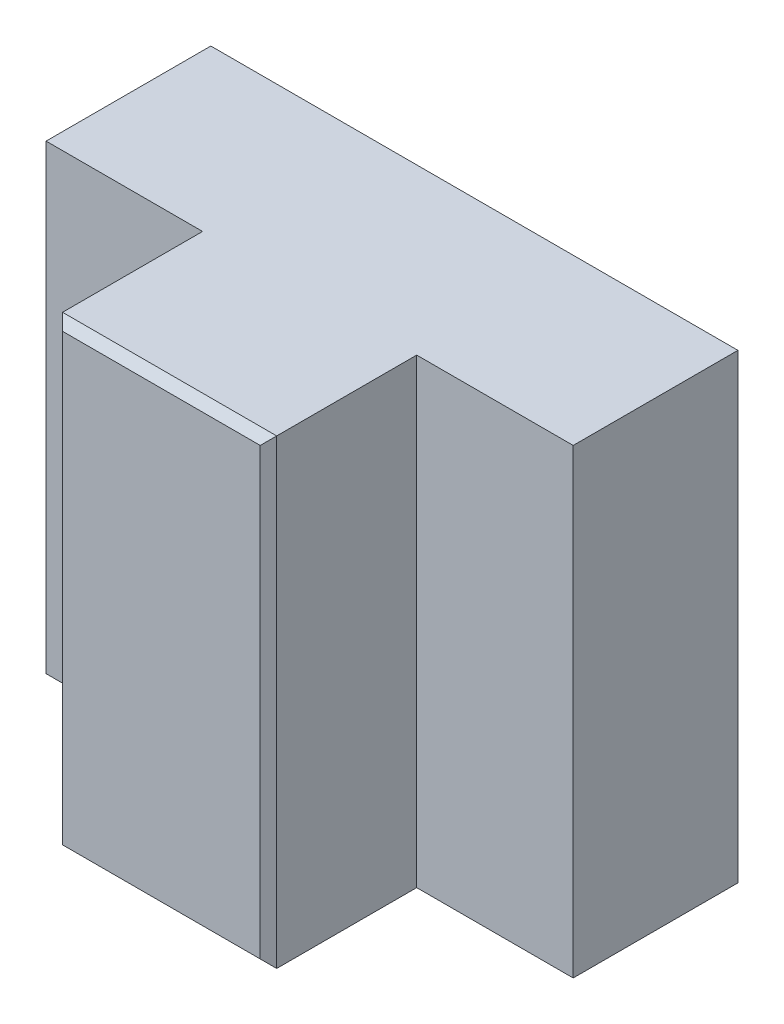
ISO-10303-21;
HEADER;
FILE_DESCRIPTION(('STEP AP214'),'2;1');
FILE_NAME('part.step','',(''),(''),'','','');
FILE_SCHEMA(('AUTOMOTIVE_DESIGN { 1 0 10303 214 1 1 1 1 }'));
ENDSEC;
DATA;
#1=APPLICATION_CONTEXT('core data for automotive mechanical design processes');
#2=APPLICATION_PROTOCOL_DEFINITION('international standard','automotive_design',2000,#1);
#3=PRODUCT_CONTEXT('',#1,'mechanical');
#4=PRODUCT('Part','Part','',(#3));
#5=PRODUCT_RELATED_PRODUCT_CATEGORY('part','',(#4));
#6=PRODUCT_DEFINITION_FORMATION('','',#4);
#7=PRODUCT_DEFINITION_CONTEXT('part definition',#1,'design');
#8=PRODUCT_DEFINITION('design','',#6,#7);
#9=PRODUCT_DEFINITION_SHAPE('','',#8);
#10=(LENGTH_UNIT() NAMED_UNIT(*) SI_UNIT(.MILLI.,.METRE.));
#11=(NAMED_UNIT(*) PLANE_ANGLE_UNIT() SI_UNIT($,.RADIAN.));
#12=(NAMED_UNIT(*) SI_UNIT($,.STERADIAN.) SOLID_ANGLE_UNIT());
#13=UNCERTAINTY_MEASURE_WITH_UNIT(LENGTH_MEASURE(1.E-05),#10,'distance_accuracy_value','');
#14=(GEOMETRIC_REPRESENTATION_CONTEXT(3) GLOBAL_UNCERTAINTY_ASSIGNED_CONTEXT((#13)) GLOBAL_UNIT_ASSIGNED_CONTEXT((#10,
#11,#12)) REPRESENTATION_CONTEXT('',''));
#15=CARTESIAN_POINT('',(0.,0.,0.));
#16=DIRECTION('',(0.,0.,1.));
#17=DIRECTION('',(1.,0.,0.));
#18=AXIS2_PLACEMENT_3D('',#15,#16,#17);
#19=CARTESIAN_POINT('',(0.,0.,10.));
#20=DIRECTION('',(0.,0.,1.));
#21=DIRECTION('',(1.,0.,0.));
#22=AXIS2_PLACEMENT_3D('',#19,#20,#21);
#23=PLANE('',#22);
#24=DIRECTION('',(0.,-1.,0.));
#25=VECTOR('',#24,1.);
#26=CARTESIAN_POINT('',(-6.5,-14.,10.));
#27=LINE('',#26,#25);
#28=CARTESIAN_POINT('',(-6.5,14.,10.));
#29=VERTEX_POINT('',#28);
#30=CARTESIAN_POINT('',(-6.5,-14.,10.));
#31=VERTEX_POINT('',#30);
#32=EDGE_CURVE('E148',#29,#31,#27,.T.);
#33=ORIENTED_EDGE('',*,*,#32,.F.);
#34=DIRECTION('',(-1.,0.,0.));
#35=VECTOR('',#34,1.);
#36=CARTESIAN_POINT('',(-16.,14.,10.));
#37=LINE('',#36,#35);
#38=CARTESIAN_POINT('',(-16.,14.,10.));
#39=VERTEX_POINT('',#38);
#40=EDGE_CURVE('E144',#29,#39,#37,.T.);
#41=ORIENTED_EDGE('',*,*,#40,.T.);
#42=DIRECTION('',(0.,-1.,0.));
#43=VECTOR('',#42,1.);
#44=CARTESIAN_POINT('',(-16.,14.,10.));
#45=LINE('',#44,#43);
#46=CARTESIAN_POINT('',(-16.,-14.,10.));
#47=VERTEX_POINT('',#46);
#48=EDGE_CURVE('E143',#39,#47,#45,.T.);
#49=ORIENTED_EDGE('',*,*,#48,.T.);
#50=DIRECTION('',(1.,0.,0.));
#51=VECTOR('',#50,1.);
#52=CARTESIAN_POINT('',(-16.,-14.,10.));
#53=LINE('',#52,#51);
#54=EDGE_CURVE('E169',#47,#31,#53,.T.);
#55=ORIENTED_EDGE('',*,*,#54,.T.);
#56=EDGE_LOOP('',(#33,#41,#49,#55));
#57=FACE_BOUND('',#56,.T.);
#58=ADVANCED_FACE('F41',(#57),#23,.T.);
#59=CARTESIAN_POINT('',(16.,14.,10.));
#60=DIRECTION('',(-1.,0.,0.));
#61=DIRECTION('',(0.,0.,1.));
#62=AXIS2_PLACEMENT_3D('',#59,#60,#61);
#63=PLANE('',#62);
#64=DIRECTION('',(0.,1.,0.));
#65=VECTOR('',#64,1.);
#66=CARTESIAN_POINT('',(16.,14.,0.));
#67=LINE('',#66,#65);
#68=CARTESIAN_POINT('',(16.,-14.,0.));
#69=VERTEX_POINT('',#68);
#70=CARTESIAN_POINT('',(16.,14.,0.));
#71=VERTEX_POINT('',#70);
#72=EDGE_CURVE('E162',#69,#71,#67,.T.);
#73=ORIENTED_EDGE('',*,*,#72,.T.);
#74=DIRECTION('',(0.,0.,-1.));
#75=VECTOR('',#74,1.);
#76=CARTESIAN_POINT('',(16.,14.,10.));
#77=LINE('',#76,#75);
#78=CARTESIAN_POINT('',(16.,14.,10.));
#79=VERTEX_POINT('',#78);
#80=EDGE_CURVE('E196',#79,#71,#77,.T.);
#81=ORIENTED_EDGE('',*,*,#80,.F.);
#82=DIRECTION('',(0.,1.,0.));
#83=VECTOR('',#82,1.);
#84=CARTESIAN_POINT('',(16.,14.,10.));
#85=LINE('',#84,#83);
#86=CARTESIAN_POINT('',(16.,-14.,10.));
#87=VERTEX_POINT('',#86);
#88=EDGE_CURVE('E140',#87,#79,#85,.T.);
#89=ORIENTED_EDGE('',*,*,#88,.F.);
#90=DIRECTION('',(0.,0.,-1.));
#91=VECTOR('',#90,1.);
#92=CARTESIAN_POINT('',(16.,-14.,10.));
#93=LINE('',#92,#91);
#94=EDGE_CURVE('E173',#87,#69,#93,.T.);
#95=ORIENTED_EDGE('',*,*,#94,.T.);
#96=EDGE_LOOP('',(#73,#81,#89,#95));
#97=FACE_BOUND('',#96,.T.);
#98=ADVANCED_FACE('F273',(#97),#63,.F.);
#99=CARTESIAN_POINT('',(-16.,14.,10.));
#100=DIRECTION('',(0.,-1.,0.));
#101=DIRECTION('',(0.,0.,-1.));
#102=AXIS2_PLACEMENT_3D('',#99,#100,#101);
#103=PLANE('',#102);
#104=DIRECTION('',(0.,0.,-1.));
#105=VECTOR('',#104,1.);
#106=CARTESIAN_POINT('',(-6.5,14.,19.));
#107=LINE('',#106,#105);
#108=CARTESIAN_POINT('',(-6.5,14.,18.5));
#109=VERTEX_POINT('',#108);
#110=EDGE_CURVE('E159',#109,#29,#107,.T.);
#111=ORIENTED_EDGE('',*,*,#110,.F.);
#112=DIRECTION('',(1.,0.,0.));
#113=VECTOR('',#112,1.);
#114=CARTESIAN_POINT('',(-16.,14.,18.5));
#115=LINE('',#114,#113);
#116=CARTESIAN_POINT('',(6.5,14.,18.5));
#117=VERTEX_POINT('',#116);
#118=EDGE_CURVE('E11',#109,#117,#115,.T.);
#119=ORIENTED_EDGE('',*,*,#118,.T.);
#120=DIRECTION('',(0.,0.,-1.));
#121=VECTOR('',#120,1.);
#122=CARTESIAN_POINT('',(6.5,14.,19.));
#123=LINE('',#122,#121);
#124=CARTESIAN_POINT('',(6.5,14.,10.));
#125=VERTEX_POINT('',#124);
#126=EDGE_CURVE('E120',#117,#125,#123,.T.);
#127=ORIENTED_EDGE('',*,*,#126,.T.);
#128=EDGE_CURVE('E124',#79,#125,#37,.T.);
#129=ORIENTED_EDGE('',*,*,#128,.F.);
#130=ORIENTED_EDGE('',*,*,#80,.T.);
#131=DIRECTION('',(-1.,0.,0.));
#132=VECTOR('',#131,1.);
#133=CARTESIAN_POINT('',(-16.,14.,0.));
#134=LINE('',#133,#132);
#135=CARTESIAN_POINT('',(-16.,14.,0.));
#136=VERTEX_POINT('',#135);
#137=EDGE_CURVE('E177',#71,#136,#134,.T.);
#138=ORIENTED_EDGE('',*,*,#137,.T.);
#139=DIRECTION('',(0.,0.,-1.));
#140=VECTOR('',#139,1.);
#141=CARTESIAN_POINT('',(-16.,14.,10.));
#142=LINE('',#141,#140);
#143=EDGE_CURVE('E192',#39,#136,#142,.T.);
#144=ORIENTED_EDGE('',*,*,#143,.F.);
#145=ORIENTED_EDGE('',*,*,#40,.F.);
#146=EDGE_LOOP('',(#111,#119,#127,#129,#130,#138,#144,#145));
#147=FACE_BOUND('',#146,.T.);
#148=ADVANCED_FACE('F122',(#147),#103,.F.);
#149=CARTESIAN_POINT('',(-16.,14.,10.));
#150=DIRECTION('',(1.,0.,0.));
#151=DIRECTION('',(0.,0.,-1.));
#152=AXIS2_PLACEMENT_3D('',#149,#150,#151);
#153=PLANE('',#152);
#154=DIRECTION('',(0.,-1.,0.));
#155=VECTOR('',#154,1.);
#156=CARTESIAN_POINT('',(-16.,14.,0.));
#157=LINE('',#156,#155);
#158=CARTESIAN_POINT('',(-16.,-14.,0.));
#159=VERTEX_POINT('',#158);
#160=EDGE_CURVE('E180',#136,#159,#157,.T.);
#161=ORIENTED_EDGE('',*,*,#160,.T.);
#162=DIRECTION('',(0.,0.,-1.));
#163=VECTOR('',#162,1.);
#164=CARTESIAN_POINT('',(-16.,-14.,10.));
#165=LINE('',#164,#163);
#166=EDGE_CURVE('E188',#47,#159,#165,.T.);
#167=ORIENTED_EDGE('',*,*,#166,.F.);
#168=ORIENTED_EDGE('',*,*,#48,.F.);
#169=ORIENTED_EDGE('',*,*,#143,.T.);
#170=EDGE_LOOP('',(#161,#167,#168,#169));
#171=FACE_BOUND('',#170,.T.);
#172=ADVANCED_FACE('F256',(#171),#153,.F.);
#173=CARTESIAN_POINT('',(-16.,-14.,10.));
#174=DIRECTION('',(0.,1.,0.));
#175=DIRECTION('',(0.,0.,1.));
#176=AXIS2_PLACEMENT_3D('',#173,#174,#175);
#177=PLANE('',#176);
#178=DIRECTION('',(0.,0.,-1.));
#179=VECTOR('',#178,1.);
#180=CARTESIAN_POINT('',(6.5,-14.,19.));
#181=LINE('',#180,#179);
#182=CARTESIAN_POINT('',(6.5,-14.,18.5));
#183=VERTEX_POINT('',#182);
#184=CARTESIAN_POINT('',(6.5,-14.,10.));
#185=VERTEX_POINT('',#184);
#186=EDGE_CURVE('E132',#183,#185,#181,.T.);
#187=ORIENTED_EDGE('',*,*,#186,.F.);
#188=DIRECTION('',(-1.,0.,0.));
#189=VECTOR('',#188,1.);
#190=CARTESIAN_POINT('',(-16.,-14.,18.5));
#191=LINE('',#190,#189);
#192=CARTESIAN_POINT('',(-6.5,-14.,18.5));
#193=VERTEX_POINT('',#192);
#194=EDGE_CURVE('E67',#183,#193,#191,.T.);
#195=ORIENTED_EDGE('',*,*,#194,.T.);
#196=DIRECTION('',(0.,0.,-1.));
#197=VECTOR('',#196,1.);
#198=CARTESIAN_POINT('',(-6.5,-14.,19.));
#199=LINE('',#198,#197);
#200=EDGE_CURVE('E156',#193,#31,#199,.T.);
#201=ORIENTED_EDGE('',*,*,#200,.T.);
#202=ORIENTED_EDGE('',*,*,#54,.F.);
#203=ORIENTED_EDGE('',*,*,#166,.T.);
#204=DIRECTION('',(1.,0.,0.));
#205=VECTOR('',#204,1.);
#206=CARTESIAN_POINT('',(-16.,-14.,0.));
#207=LINE('',#206,#205);
#208=EDGE_CURVE('E164',#159,#69,#207,.T.);
#209=ORIENTED_EDGE('',*,*,#208,.T.);
#210=ORIENTED_EDGE('',*,*,#94,.F.);
#211=EDGE_CURVE('E168',#185,#87,#53,.T.);
#212=ORIENTED_EDGE('',*,*,#211,.F.);
#213=EDGE_LOOP('',(#187,#195,#201,#202,#203,#209,#210,#212));
#214=FACE_BOUND('',#213,.T.);
#215=ADVANCED_FACE('F244',(#214),#177,.F.);
#216=DIRECTION('',(0.,1.,0.));
#217=VECTOR('',#216,1.);
#218=CARTESIAN_POINT('',(6.5,14.,10.));
#219=LINE('',#218,#217);
#220=EDGE_CURVE('E133',#185,#125,#219,.T.);
#221=ORIENTED_EDGE('',*,*,#220,.F.);
#222=ORIENTED_EDGE('',*,*,#211,.T.);
#223=ORIENTED_EDGE('',*,*,#88,.T.);
#224=ORIENTED_EDGE('',*,*,#128,.T.);
#225=EDGE_LOOP('',(#221,#222,#223,#224));
#226=FACE_BOUND('',#225,.T.);
#227=ADVANCED_FACE('F137',(#226),#23,.T.);
#228=CARTESIAN_POINT('',(0.,0.,0.));
#229=DIRECTION('',(0.,0.,1.));
#230=DIRECTION('',(1.,0.,0.));
#231=AXIS2_PLACEMENT_3D('',#228,#229,#230);
#232=PLANE('',#231);
#233=ORIENTED_EDGE('',*,*,#72,.F.);
#234=ORIENTED_EDGE('',*,*,#208,.F.);
#235=ORIENTED_EDGE('',*,*,#160,.F.);
#236=ORIENTED_EDGE('',*,*,#137,.F.);
#237=EDGE_LOOP('',(#233,#234,#235,#236));
#238=FACE_BOUND('',#237,.T.);
#239=ADVANCED_FACE('F261',(#238),#232,.F.);
#240=CARTESIAN_POINT('',(-6.5,-14.,19.));
#241=DIRECTION('',(1.,0.,0.));
#242=DIRECTION('',(0.,1.,0.));
#243=AXIS2_PLACEMENT_3D('',#240,#241,#242);
#244=PLANE('',#243);
#245=ORIENTED_EDGE('',*,*,#200,.F.);
#246=DIRECTION('',(0.,1.,0.));
#247=VECTOR('',#246,1.);
#248=CARTESIAN_POINT('',(-6.5,-14.,18.5));
#249=LINE('',#248,#247);
#250=EDGE_CURVE('E52',#193,#109,#249,.T.);
#251=ORIENTED_EDGE('',*,*,#250,.T.);
#252=ORIENTED_EDGE('',*,*,#110,.T.);
#253=ORIENTED_EDGE('',*,*,#32,.T.);
#254=EDGE_LOOP('',(#245,#251,#252,#253));
#255=FACE_BOUND('',#254,.T.);
#256=ADVANCED_FACE('F259',(#255),#244,.F.);
#257=CARTESIAN_POINT('',(6.5,14.,19.));
#258=DIRECTION('',(-1.,0.,0.));
#259=DIRECTION('',(0.,-1.,0.));
#260=AXIS2_PLACEMENT_3D('',#257,#258,#259);
#261=PLANE('',#260);
#262=ORIENTED_EDGE('',*,*,#126,.F.);
#263=DIRECTION('',(0.,-1.,0.));
#264=VECTOR('',#263,1.);
#265=CARTESIAN_POINT('',(6.5,14.,18.5));
#266=LINE('',#265,#264);
#267=EDGE_CURVE('E212',#117,#183,#266,.T.);
#268=ORIENTED_EDGE('',*,*,#267,.T.);
#269=ORIENTED_EDGE('',*,*,#186,.T.);
#270=ORIENTED_EDGE('',*,*,#220,.T.);
#271=EDGE_LOOP('',(#262,#268,#269,#270));
#272=FACE_BOUND('',#271,.T.);
#273=ADVANCED_FACE('F146',(#272),#261,.F.);
#274=CARTESIAN_POINT('',(0.,0.,19.));
#275=DIRECTION('',(0.,0.,-1.));
#276=DIRECTION('',(-1.,0.,0.));
#277=AXIS2_PLACEMENT_3D('',#274,#275,#276);
#278=PLANE('',#277);
#279=DIRECTION('',(1.,0.,0.));
#280=VECTOR('',#279,1.);
#281=CARTESIAN_POINT('',(0.,-13.5,19.));
#282=LINE('',#281,#280);
#283=CARTESIAN_POINT('',(-6.,-13.5,19.));
#284=VERTEX_POINT('',#283);
#285=CARTESIAN_POINT('',(6.,-13.5,19.));
#286=VERTEX_POINT('',#285);
#287=EDGE_CURVE('E205',#284,#286,#282,.T.);
#288=ORIENTED_EDGE('',*,*,#287,.T.);
#289=DIRECTION('',(0.,1.,0.));
#290=VECTOR('',#289,1.);
#291=CARTESIAN_POINT('',(6.,0.,19.));
#292=LINE('',#291,#290);
#293=CARTESIAN_POINT('',(6.,13.5,19.));
#294=VERTEX_POINT('',#293);
#295=EDGE_CURVE('E208',#286,#294,#292,.T.);
#296=ORIENTED_EDGE('',*,*,#295,.T.);
#297=DIRECTION('',(-1.,0.,0.));
#298=VECTOR('',#297,1.);
#299=CARTESIAN_POINT('',(0.,13.5,19.));
#300=LINE('',#299,#298);
#301=CARTESIAN_POINT('',(-6.,13.5,19.));
#302=VERTEX_POINT('',#301);
#303=EDGE_CURVE('E199',#294,#302,#300,.T.);
#304=ORIENTED_EDGE('',*,*,#303,.T.);
#305=DIRECTION('',(0.,-1.,0.));
#306=VECTOR('',#305,1.);
#307=CARTESIAN_POINT('',(-6.,0.,19.));
#308=LINE('',#307,#306);
#309=EDGE_CURVE('E202',#302,#284,#308,.T.);
#310=ORIENTED_EDGE('',*,*,#309,.T.);
#311=EDGE_LOOP('',(#288,#296,#304,#310));
#312=FACE_BOUND('',#311,.T.);
#313=ADVANCED_FACE('F267',(#312),#278,.F.);
#314=CARTESIAN_POINT('',(-6.,0.,19.));
#315=DIRECTION('',(0.707106781186553,0.,-0.707106781186542));
#316=DIRECTION('',(0.,-1.,0.));
#317=AXIS2_PLACEMENT_3D('',#314,#315,#316);
#318=PLANE('',#317);
#319=DIRECTION('',(0.577350269189623,-0.577350269189623,0.577350269189631));
#320=VECTOR('',#319,1.);
#321=CARTESIAN_POINT('',(-4.00000000000002,11.5,21.));
#322=LINE('',#321,#320);
#323=EDGE_CURVE('E224',#109,#302,#322,.T.);
#324=ORIENTED_EDGE('',*,*,#323,.F.);
#325=ORIENTED_EDGE('',*,*,#250,.F.);
#326=DIRECTION('',(0.577350269189623,0.577350269189623,0.577350269189631));
#327=VECTOR('',#326,1.);
#328=CARTESIAN_POINT('',(-1.50000000000004,-9.00000000000004,23.5));
#329=LINE('',#328,#327);
#330=EDGE_CURVE('E46',#284,#193,#329,.F.);
#331=ORIENTED_EDGE('',*,*,#330,.F.);
#332=ORIENTED_EDGE('',*,*,#309,.F.);
#333=EDGE_LOOP('',(#324,#325,#331,#332));
#334=FACE_BOUND('',#333,.T.);
#335=ADVANCED_FACE('F44',(#334),#318,.F.);
#336=CARTESIAN_POINT('',(0.,-13.5,19.));
#337=DIRECTION('',(0.,0.707106781186552,-0.707106781186542));
#338=DIRECTION('',(1.,0.,0.));
#339=AXIS2_PLACEMENT_3D('',#336,#337,#338);
#340=PLANE('',#339);
#341=ORIENTED_EDGE('',*,*,#330,.T.);
#342=ORIENTED_EDGE('',*,*,#194,.F.);
#343=DIRECTION('',(-0.577350269189624,0.577350269189623,0.577350269189631));
#344=VECTOR('',#343,1.);
#345=CARTESIAN_POINT('',(4.00000000000001,-11.5,21.));
#346=LINE('',#345,#344);
#347=EDGE_CURVE('E222',#286,#183,#346,.F.);
#348=ORIENTED_EDGE('',*,*,#347,.F.);
#349=ORIENTED_EDGE('',*,*,#287,.F.);
#350=EDGE_LOOP('',(#341,#342,#348,#349));
#351=FACE_BOUND('',#350,.T.);
#352=ADVANCED_FACE('F235',(#351),#340,.F.);
#353=CARTESIAN_POINT('',(0.,13.5,19.));
#354=DIRECTION('',(0.,-0.707106781186552,-0.707106781186542));
#355=DIRECTION('',(-1.,0.,0.));
#356=AXIS2_PLACEMENT_3D('',#353,#354,#355);
#357=PLANE('',#356);
#358=ORIENTED_EDGE('',*,*,#323,.T.);
#359=ORIENTED_EDGE('',*,*,#303,.F.);
#360=DIRECTION('',(0.577350269189624,0.577350269189623,-0.577350269189631));
#361=VECTOR('',#360,1.);
#362=CARTESIAN_POINT('',(4.00000000000001,11.5,21.));
#363=LINE('',#362,#361);
#364=EDGE_CURVE('E219',#117,#294,#363,.F.);
#365=ORIENTED_EDGE('',*,*,#364,.F.);
#366=ORIENTED_EDGE('',*,*,#118,.F.);
#367=EDGE_LOOP('',(#358,#359,#365,#366));
#368=FACE_BOUND('',#367,.T.);
#369=ADVANCED_FACE('F240',(#368),#357,.F.);
#370=CARTESIAN_POINT('',(6.,0.,19.));
#371=DIRECTION('',(-0.707106781186551,0.,-0.707106781186544));
#372=DIRECTION('',(0.,1.,0.));
#373=AXIS2_PLACEMENT_3D('',#370,#371,#372);
#374=PLANE('',#373);
#375=ORIENTED_EDGE('',*,*,#347,.T.);
#376=ORIENTED_EDGE('',*,*,#267,.F.);
#377=ORIENTED_EDGE('',*,*,#364,.T.);
#378=ORIENTED_EDGE('',*,*,#295,.F.);
#379=EDGE_LOOP('',(#375,#376,#377,#378));
#380=FACE_BOUND('',#379,.T.);
#381=ADVANCED_FACE('F243',(#380),#374,.F.);
#382=CLOSED_SHELL('',(#58,#98,#148,#172,#215,#227,#239,#256,#273,#313,#335,#352,#369,#381));
#383=MANIFOLD_SOLID_BREP('B2',#382);
#384=ADVANCED_BREP_SHAPE_REPRESENTATION('',(#18,#383),#14);
#385=SHAPE_DEFINITION_REPRESENTATION(#9,#384);
ENDSEC;
END-ISO-10303-21;
